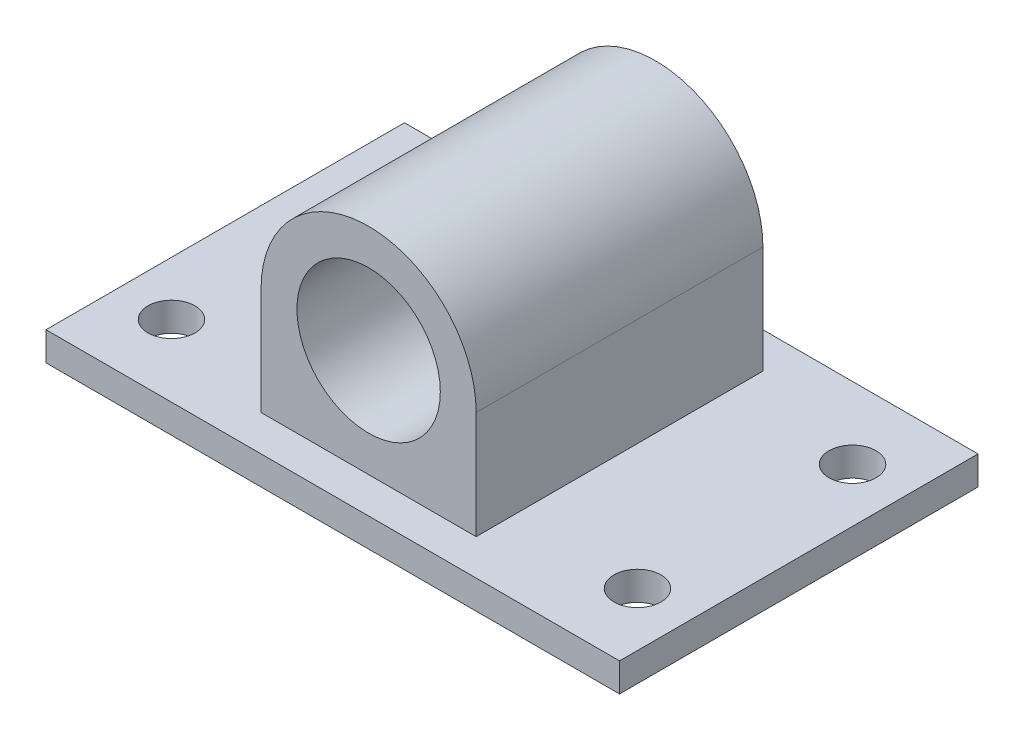
ISO-10303-21;
HEADER;
FILE_DESCRIPTION(('STEP AP214'),'2;1');
FILE_NAME('part.step','',(''),(''),'','','');
FILE_SCHEMA(('AUTOMOTIVE_DESIGN { 1 0 10303 214 1 1 1 1 }'));
ENDSEC;
DATA;
#1=APPLICATION_CONTEXT('core data for automotive mechanical design processes');
#2=APPLICATION_PROTOCOL_DEFINITION('international standard','automotive_design',2000,#1);
#3=PRODUCT_CONTEXT('',#1,'mechanical');
#4=PRODUCT('Part','Part','',(#3));
#5=PRODUCT_RELATED_PRODUCT_CATEGORY('part','',(#4));
#6=PRODUCT_DEFINITION_FORMATION('','',#4);
#7=PRODUCT_DEFINITION_CONTEXT('part definition',#1,'design');
#8=PRODUCT_DEFINITION('design','',#6,#7);
#9=PRODUCT_DEFINITION_SHAPE('','',#8);
#10=(LENGTH_UNIT() NAMED_UNIT(*) SI_UNIT(.MILLI.,.METRE.));
#11=(NAMED_UNIT(*) PLANE_ANGLE_UNIT() SI_UNIT($,.RADIAN.));
#12=(NAMED_UNIT(*) SI_UNIT($,.STERADIAN.) SOLID_ANGLE_UNIT());
#13=UNCERTAINTY_MEASURE_WITH_UNIT(LENGTH_MEASURE(1.E-05),#10,'distance_accuracy_value','');
#14=(GEOMETRIC_REPRESENTATION_CONTEXT(3) GLOBAL_UNCERTAINTY_ASSIGNED_CONTEXT((#13)) GLOBAL_UNIT_ASSIGNED_CONTEXT((#10,
#11,#12)) REPRESENTATION_CONTEXT('',''));
#15=CARTESIAN_POINT('',(0.,0.,0.));
#16=DIRECTION('',(0.,0.,1.));
#17=DIRECTION('',(1.,0.,0.));
#18=AXIS2_PLACEMENT_3D('',#15,#16,#17);
#19=CARTESIAN_POINT('',(0.,5.08,0.));
#20=DIRECTION('',(0.,-1.,0.));
#21=DIRECTION('',(0.,0.,-1.));
#22=AXIS2_PLACEMENT_3D('',#19,#20,#21);
#23=PLANE('',#22);
#24=DIRECTION('',(0.,0.,-1.));
#25=VECTOR('',#24,1.);
#26=CARTESIAN_POINT('',(50.8,5.08,31.75));
#27=LINE('',#26,#25);
#28=CARTESIAN_POINT('',(50.8,5.08,31.75));
#29=VERTEX_POINT('',#28);
#30=CARTESIAN_POINT('',(50.8,5.08,-31.75));
#31=VERTEX_POINT('',#30);
#32=EDGE_CURVE('E167',#29,#31,#27,.T.);
#33=ORIENTED_EDGE('',*,*,#32,.T.);
#34=DIRECTION('',(-1.,0.,0.));
#35=VECTOR('',#34,1.);
#36=CARTESIAN_POINT('',(-50.8,5.08,-31.75));
#37=LINE('',#36,#35);
#38=CARTESIAN_POINT('',(-50.8,5.08,-31.75));
#39=VERTEX_POINT('',#38);
#40=EDGE_CURVE('E171',#31,#39,#37,.T.);
#41=ORIENTED_EDGE('',*,*,#40,.T.);
#42=DIRECTION('',(0.,0.,1.));
#43=VECTOR('',#42,1.);
#44=CARTESIAN_POINT('',(-50.8,5.08,31.75));
#45=LINE('',#44,#43);
#46=CARTESIAN_POINT('',(-50.8,5.08,31.75));
#47=VERTEX_POINT('',#46);
#48=EDGE_CURVE('E175',#39,#47,#45,.T.);
#49=ORIENTED_EDGE('',*,*,#48,.T.);
#50=DIRECTION('',(1.,0.,0.));
#51=VECTOR('',#50,1.);
#52=CARTESIAN_POINT('',(-50.8,5.08,31.75));
#53=LINE('',#52,#51);
#54=EDGE_CURVE('E178',#47,#29,#53,.T.);
#55=ORIENTED_EDGE('',*,*,#54,.T.);
#56=EDGE_LOOP('',(#33,#41,#49,#55));
#57=FACE_BOUND('',#56,.T.);
#58=CARTESIAN_POINT('',(-41.275,5.08,-19.05));
#59=DIRECTION('',(0.,1.,0.));
#60=DIRECTION('',(0.,0.,1.));
#61=AXIS2_PLACEMENT_3D('',#58,#59,#60);
#62=CIRCLE('',#61,4.1656);
#63=CARTESIAN_POINT('',(-41.275,5.08,-14.8844));
#64=VERTEX_POINT('',#63);
#65=EDGE_CURVE('E159',#64,#64,#62,.T.);
#66=ORIENTED_EDGE('',*,*,#65,.F.);
#67=EDGE_LOOP('',(#66));
#68=FACE_BOUND('',#67,.T.);
#69=CARTESIAN_POINT('',(41.275,5.08,-19.05));
#70=DIRECTION('',(0.,1.,0.));
#71=DIRECTION('',(0.,0.,1.));
#72=AXIS2_PLACEMENT_3D('',#69,#70,#71);
#73=CIRCLE('',#72,4.1656);
#74=CARTESIAN_POINT('',(41.275,5.08,-14.8844));
#75=VERTEX_POINT('',#74);
#76=EDGE_CURVE('E139',#75,#75,#73,.T.);
#77=ORIENTED_EDGE('',*,*,#76,.F.);
#78=EDGE_LOOP('',(#77));
#79=FACE_BOUND('',#78,.T.);
#80=CARTESIAN_POINT('',(41.275,5.08,19.05));
#81=DIRECTION('',(0.,1.,0.));
#82=DIRECTION('',(0.,0.,1.));
#83=AXIS2_PLACEMENT_3D('',#80,#81,#82);
#84=CIRCLE('',#83,4.1656);
#85=CARTESIAN_POINT('',(41.275,5.08,23.2156));
#86=VERTEX_POINT('',#85);
#87=EDGE_CURVE('E148',#86,#86,#84,.T.);
#88=ORIENTED_EDGE('',*,*,#87,.F.);
#89=EDGE_LOOP('',(#88));
#90=FACE_BOUND('',#89,.T.);
#91=CARTESIAN_POINT('',(-41.275,5.08,19.05));
#92=DIRECTION('',(0.,1.,0.));
#93=DIRECTION('',(0.,0.,1.));
#94=AXIS2_PLACEMENT_3D('',#91,#92,#93);
#95=CIRCLE('',#94,4.1656);
#96=CARTESIAN_POINT('',(-41.275,5.08,23.2156));
#97=VERTEX_POINT('',#96);
#98=EDGE_CURVE('E133',#97,#97,#95,.T.);
#99=ORIENTED_EDGE('',*,*,#98,.F.);
#100=EDGE_LOOP('',(#99));
#101=FACE_BOUND('',#100,.T.);
#102=DIRECTION('',(0.,0.,-1.));
#103=VECTOR('',#102,1.);
#104=CARTESIAN_POINT('',(-19.05,5.08,25.4));
#105=LINE('',#104,#103);
#106=CARTESIAN_POINT('',(-19.05,5.08,25.4));
#107=VERTEX_POINT('',#106);
#108=CARTESIAN_POINT('',(-19.05,5.08,-25.4));
#109=VERTEX_POINT('',#108);
#110=EDGE_CURVE('E60',#107,#109,#105,.T.);
#111=ORIENTED_EDGE('',*,*,#110,.T.);
#112=DIRECTION('',(1.,0.,0.));
#113=VECTOR('',#112,1.);
#114=CARTESIAN_POINT('',(-19.05,5.08,-25.4));
#115=LINE('',#114,#113);
#116=CARTESIAN_POINT('',(19.05,5.08,-25.4));
#117=VERTEX_POINT('',#116);
#118=EDGE_CURVE('E386',#109,#117,#115,.T.);
#119=ORIENTED_EDGE('',*,*,#118,.T.);
#120=DIRECTION('',(0.,0.,-1.));
#121=VECTOR('',#120,1.);
#122=CARTESIAN_POINT('',(19.05,5.08,25.4));
#123=LINE('',#122,#121);
#124=CARTESIAN_POINT('',(19.05,5.08,25.4));
#125=VERTEX_POINT('',#124);
#126=EDGE_CURVE('E135',#125,#117,#123,.T.);
#127=ORIENTED_EDGE('',*,*,#126,.F.);
#128=DIRECTION('',(1.,0.,0.));
#129=VECTOR('',#128,1.);
#130=CARTESIAN_POINT('',(-19.05,5.08,25.4));
#131=LINE('',#130,#129);
#132=EDGE_CURVE('E55',#107,#125,#131,.T.);
#133=ORIENTED_EDGE('',*,*,#132,.F.);
#134=EDGE_LOOP('',(#111,#119,#127,#133));
#135=FACE_BOUND('',#134,.T.);
#136=ADVANCED_FACE('F39',(#57,#68,#79,#90,#101,#135),#23,.F.);
#137=CARTESIAN_POINT('',(50.8,5.08,31.75));
#138=DIRECTION('',(-1.,0.,0.));
#139=DIRECTION('',(0.,0.,1.));
#140=AXIS2_PLACEMENT_3D('',#137,#138,#139);
#141=PLANE('',#140);
#142=DIRECTION('',(0.,0.,-1.));
#143=VECTOR('',#142,1.);
#144=CARTESIAN_POINT('',(50.8,0.,31.75));
#145=LINE('',#144,#143);
#146=CARTESIAN_POINT('',(50.8,0.,31.75));
#147=VERTEX_POINT('',#146);
#148=CARTESIAN_POINT('',(50.8,0.,-31.75));
#149=VERTEX_POINT('',#148);
#150=EDGE_CURVE('E163',#147,#149,#145,.T.);
#151=ORIENTED_EDGE('',*,*,#150,.T.);
#152=DIRECTION('',(0.,-1.,0.));
#153=VECTOR('',#152,1.);
#154=CARTESIAN_POINT('',(50.8,5.08,-31.75));
#155=LINE('',#154,#153);
#156=EDGE_CURVE('E11',#31,#149,#155,.T.);
#157=ORIENTED_EDGE('',*,*,#156,.F.);
#158=ORIENTED_EDGE('',*,*,#32,.F.);
#159=DIRECTION('',(0.,-1.,0.));
#160=VECTOR('',#159,1.);
#161=CARTESIAN_POINT('',(50.8,5.08,31.75));
#162=LINE('',#161,#160);
#163=EDGE_CURVE('E181',#29,#147,#162,.T.);
#164=ORIENTED_EDGE('',*,*,#163,.T.);
#165=EDGE_LOOP('',(#151,#157,#158,#164));
#166=FACE_BOUND('',#165,.T.);
#167=ADVANCED_FACE('F41',(#166),#141,.F.);
#168=CARTESIAN_POINT('',(-50.8,5.08,-31.75));
#169=DIRECTION('',(0.,0.,1.));
#170=DIRECTION('',(1.,0.,0.));
#171=AXIS2_PLACEMENT_3D('',#168,#169,#170);
#172=PLANE('',#171);
#173=DIRECTION('',(-1.,0.,0.));
#174=VECTOR('',#173,1.);
#175=CARTESIAN_POINT('',(-50.8,0.,-31.75));
#176=LINE('',#175,#174);
#177=CARTESIAN_POINT('',(-50.8,0.,-31.75));
#178=VERTEX_POINT('',#177);
#179=EDGE_CURVE('E185',#149,#178,#176,.T.);
#180=ORIENTED_EDGE('',*,*,#179,.T.);
#181=DIRECTION('',(0.,-1.,0.));
#182=VECTOR('',#181,1.);
#183=CARTESIAN_POINT('',(-50.8,5.08,-31.75));
#184=LINE('',#183,#182);
#185=EDGE_CURVE('E48',#39,#178,#184,.T.);
#186=ORIENTED_EDGE('',*,*,#185,.F.);
#187=ORIENTED_EDGE('',*,*,#40,.F.);
#188=ORIENTED_EDGE('',*,*,#156,.T.);
#189=EDGE_LOOP('',(#180,#186,#187,#188));
#190=FACE_BOUND('',#189,.T.);
#191=ADVANCED_FACE('F221',(#190),#172,.F.);
#192=CARTESIAN_POINT('',(-50.8,5.08,31.75));
#193=DIRECTION('',(1.,0.,0.));
#194=DIRECTION('',(0.,0.,-1.));
#195=AXIS2_PLACEMENT_3D('',#192,#193,#194);
#196=PLANE('',#195);
#197=DIRECTION('',(0.,0.,1.));
#198=VECTOR('',#197,1.);
#199=CARTESIAN_POINT('',(-50.8,0.,31.75));
#200=LINE('',#199,#198);
#201=CARTESIAN_POINT('',(-50.8,0.,31.75));
#202=VERTEX_POINT('',#201);
#203=EDGE_CURVE('E188',#178,#202,#200,.T.);
#204=ORIENTED_EDGE('',*,*,#203,.T.);
#205=DIRECTION('',(0.,-1.,0.));
#206=VECTOR('',#205,1.);
#207=CARTESIAN_POINT('',(-50.8,5.08,31.75));
#208=LINE('',#207,#206);
#209=EDGE_CURVE('E196',#47,#202,#208,.T.);
#210=ORIENTED_EDGE('',*,*,#209,.F.);
#211=ORIENTED_EDGE('',*,*,#48,.F.);
#212=ORIENTED_EDGE('',*,*,#185,.T.);
#213=EDGE_LOOP('',(#204,#210,#211,#212));
#214=FACE_BOUND('',#213,.T.);
#215=ADVANCED_FACE('F205',(#214),#196,.F.);
#216=CARTESIAN_POINT('',(-50.8,5.08,31.75));
#217=DIRECTION('',(0.,0.,-1.));
#218=DIRECTION('',(-1.,0.,0.));
#219=AXIS2_PLACEMENT_3D('',#216,#217,#218);
#220=PLANE('',#219);
#221=DIRECTION('',(1.,0.,0.));
#222=VECTOR('',#221,1.);
#223=CARTESIAN_POINT('',(-50.8,0.,31.75));
#224=LINE('',#223,#222);
#225=EDGE_CURVE('E172',#202,#147,#224,.T.);
#226=ORIENTED_EDGE('',*,*,#225,.T.);
#227=ORIENTED_EDGE('',*,*,#163,.F.);
#228=ORIENTED_EDGE('',*,*,#54,.F.);
#229=ORIENTED_EDGE('',*,*,#209,.T.);
#230=EDGE_LOOP('',(#226,#227,#228,#229));
#231=FACE_BOUND('',#230,.T.);
#232=ADVANCED_FACE('F214',(#231),#220,.F.);
#233=CARTESIAN_POINT('',(0.,0.,0.));
#234=DIRECTION('',(0.,-1.,0.));
#235=DIRECTION('',(0.,0.,-1.));
#236=AXIS2_PLACEMENT_3D('',#233,#234,#235);
#237=PLANE('',#236);
#238=CARTESIAN_POINT('',(-41.275,0.,19.05));
#239=DIRECTION('',(0.,1.,0.));
#240=DIRECTION('',(0.,0.,1.));
#241=AXIS2_PLACEMENT_3D('',#238,#239,#240);
#242=CIRCLE('',#241,4.1656);
#243=CARTESIAN_POINT('',(-41.275,0.,23.2156));
#244=VERTEX_POINT('',#243);
#245=EDGE_CURVE('E128',#244,#244,#242,.T.);
#246=ORIENTED_EDGE('',*,*,#245,.T.);
#247=EDGE_LOOP('',(#246));
#248=FACE_BOUND('',#247,.T.);
#249=CARTESIAN_POINT('',(41.275,0.,19.05));
#250=DIRECTION('',(0.,1.,0.));
#251=DIRECTION('',(0.,0.,1.));
#252=AXIS2_PLACEMENT_3D('',#249,#250,#251);
#253=CIRCLE('',#252,4.1656);
#254=CARTESIAN_POINT('',(41.275,0.,23.2156));
#255=VERTEX_POINT('',#254);
#256=EDGE_CURVE('E152',#255,#255,#253,.T.);
#257=ORIENTED_EDGE('',*,*,#256,.T.);
#258=EDGE_LOOP('',(#257));
#259=FACE_BOUND('',#258,.T.);
#260=CARTESIAN_POINT('',(41.275,0.,-19.05));
#261=DIRECTION('',(0.,1.,0.));
#262=DIRECTION('',(0.,0.,1.));
#263=AXIS2_PLACEMENT_3D('',#260,#261,#262);
#264=CIRCLE('',#263,4.1656);
#265=CARTESIAN_POINT('',(41.275,0.,-14.8844));
#266=VERTEX_POINT('',#265);
#267=EDGE_CURVE('E144',#266,#266,#264,.T.);
#268=ORIENTED_EDGE('',*,*,#267,.T.);
#269=EDGE_LOOP('',(#268));
#270=FACE_BOUND('',#269,.T.);
#271=CARTESIAN_POINT('',(-41.275,0.,-19.05));
#272=DIRECTION('',(0.,1.,0.));
#273=DIRECTION('',(0.,0.,1.));
#274=AXIS2_PLACEMENT_3D('',#271,#272,#273);
#275=CIRCLE('',#274,4.1656);
#276=CARTESIAN_POINT('',(-41.275,0.,-14.8844));
#277=VERTEX_POINT('',#276);
#278=EDGE_CURVE('E143',#277,#277,#275,.T.);
#279=ORIENTED_EDGE('',*,*,#278,.T.);
#280=EDGE_LOOP('',(#279));
#281=FACE_BOUND('',#280,.T.);
#282=ORIENTED_EDGE('',*,*,#150,.F.);
#283=ORIENTED_EDGE('',*,*,#225,.F.);
#284=ORIENTED_EDGE('',*,*,#203,.F.);
#285=ORIENTED_EDGE('',*,*,#179,.F.);
#286=EDGE_LOOP('',(#282,#283,#284,#285));
#287=FACE_BOUND('',#286,.T.);
#288=ADVANCED_FACE('F211',(#248,#259,#270,#281,#287),#237,.T.);
#289=CARTESIAN_POINT('',(-41.275,5.08,-19.05));
#290=DIRECTION('',(0.,-1.,0.));
#291=DIRECTION('',(0.,0.,-1.));
#292=AXIS2_PLACEMENT_3D('',#289,#290,#291);
#293=CYLINDRICAL_SURFACE('',#292,4.1656);
#294=ORIENTED_EDGE('',*,*,#65,.T.);
#295=EDGE_LOOP('',(#294));
#296=FACE_BOUND('',#295,.T.);
#297=ORIENTED_EDGE('',*,*,#278,.F.);
#298=EDGE_LOOP('',(#297));
#299=FACE_BOUND('',#298,.T.);
#300=ADVANCED_FACE('F234',(#296,#299),#293,.F.);
#301=CARTESIAN_POINT('',(41.275,5.08,-19.05));
#302=DIRECTION('',(0.,-1.,0.));
#303=DIRECTION('',(0.,0.,-1.));
#304=AXIS2_PLACEMENT_3D('',#301,#302,#303);
#305=CYLINDRICAL_SURFACE('',#304,4.1656);
#306=ORIENTED_EDGE('',*,*,#76,.T.);
#307=EDGE_LOOP('',(#306));
#308=FACE_BOUND('',#307,.T.);
#309=ORIENTED_EDGE('',*,*,#267,.F.);
#310=EDGE_LOOP('',(#309));
#311=FACE_BOUND('',#310,.T.);
#312=ADVANCED_FACE('F254',(#308,#311),#305,.F.);
#313=CARTESIAN_POINT('',(41.275,5.08,19.05));
#314=DIRECTION('',(0.,-1.,0.));
#315=DIRECTION('',(0.,0.,-1.));
#316=AXIS2_PLACEMENT_3D('',#313,#314,#315);
#317=CYLINDRICAL_SURFACE('',#316,4.1656);
#318=ORIENTED_EDGE('',*,*,#87,.T.);
#319=EDGE_LOOP('',(#318));
#320=FACE_BOUND('',#319,.T.);
#321=ORIENTED_EDGE('',*,*,#256,.F.);
#322=EDGE_LOOP('',(#321));
#323=FACE_BOUND('',#322,.T.);
#324=ADVANCED_FACE('F261',(#320,#323),#317,.F.);
#325=CARTESIAN_POINT('',(-41.275,5.08,19.05));
#326=DIRECTION('',(0.,-1.,0.));
#327=DIRECTION('',(0.,0.,-1.));
#328=AXIS2_PLACEMENT_3D('',#325,#326,#327);
#329=CYLINDRICAL_SURFACE('',#328,4.1656);
#330=ORIENTED_EDGE('',*,*,#98,.T.);
#331=EDGE_LOOP('',(#330));
#332=FACE_BOUND('',#331,.T.);
#333=ORIENTED_EDGE('',*,*,#245,.F.);
#334=EDGE_LOOP('',(#333));
#335=FACE_BOUND('',#334,.T.);
#336=ADVANCED_FACE('F269',(#332,#335),#329,.F.);
#337=CARTESIAN_POINT('',(0.,24.13,25.4));
#338=DIRECTION('',(0.,0.,1.));
#339=DIRECTION('',(1.,0.,0.));
#340=AXIS2_PLACEMENT_3D('',#337,#338,#339);
#341=PLANE('',#340);
#342=CARTESIAN_POINT('',(0.,24.13,25.4));
#343=DIRECTION('',(0.,0.,1.));
#344=DIRECTION('',(1.,0.,0.));
#345=AXIS2_PLACEMENT_3D('',#342,#343,#344);
#346=CIRCLE('',#345,19.05);
#347=CARTESIAN_POINT('',(19.05,24.13,25.4));
#348=VERTEX_POINT('',#347);
#349=CARTESIAN_POINT('',(-19.05,24.13,25.4));
#350=VERTEX_POINT('',#349);
#351=EDGE_CURVE('E111',#348,#350,#346,.T.);
#352=ORIENTED_EDGE('',*,*,#351,.T.);
#353=DIRECTION('',(0.,-1.,0.));
#354=VECTOR('',#353,1.);
#355=CARTESIAN_POINT('',(-19.05,24.13,25.4));
#356=LINE('',#355,#354);
#357=EDGE_CURVE('E103',#350,#107,#356,.T.);
#358=ORIENTED_EDGE('',*,*,#357,.T.);
#359=ORIENTED_EDGE('',*,*,#132,.T.);
#360=DIRECTION('',(0.,1.,0.));
#361=VECTOR('',#360,1.);
#362=CARTESIAN_POINT('',(19.05,5.08,25.4));
#363=LINE('',#362,#361);
#364=EDGE_CURVE('E117',#125,#348,#363,.T.);
#365=ORIENTED_EDGE('',*,*,#364,.T.);
#366=EDGE_LOOP('',(#352,#358,#359,#365));
#367=FACE_BOUND('',#366,.T.);
#368=CARTESIAN_POINT('',(0.,24.13,25.4));
#369=DIRECTION('',(0.,0.,1.));
#370=DIRECTION('',(1.,0.,0.));
#371=AXIS2_PLACEMENT_3D('',#368,#369,#370);
#372=CIRCLE('',#371,12.7);
#373=CARTESIAN_POINT('',(12.7,24.13,25.4));
#374=VERTEX_POINT('',#373);
#375=EDGE_CURVE('E366',#374,#374,#372,.T.);
#376=ORIENTED_EDGE('',*,*,#375,.F.);
#377=EDGE_LOOP('',(#376));
#378=FACE_BOUND('',#377,.T.);
#379=ADVANCED_FACE('F114',(#367,#378),#341,.T.);
#380=CARTESIAN_POINT('',(0.,24.13,-25.4));
#381=DIRECTION('',(0.,0.,1.));
#382=DIRECTION('',(1.,0.,0.));
#383=AXIS2_PLACEMENT_3D('',#380,#381,#382);
#384=PLANE('',#383);
#385=CARTESIAN_POINT('',(0.,24.13,-25.4));
#386=DIRECTION('',(0.,0.,1.));
#387=DIRECTION('',(1.,0.,0.));
#388=AXIS2_PLACEMENT_3D('',#385,#386,#387);
#389=CIRCLE('',#388,19.05);
#390=CARTESIAN_POINT('',(19.05,24.13,-25.4));
#391=VERTEX_POINT('',#390);
#392=CARTESIAN_POINT('',(-19.05,24.13,-25.4));
#393=VERTEX_POINT('',#392);
#394=EDGE_CURVE('E126',#391,#393,#389,.T.);
#395=ORIENTED_EDGE('',*,*,#394,.F.);
#396=DIRECTION('',(0.,1.,0.));
#397=VECTOR('',#396,1.);
#398=CARTESIAN_POINT('',(19.05,5.08,-25.4));
#399=LINE('',#398,#397);
#400=EDGE_CURVE('E122',#117,#391,#399,.T.);
#401=ORIENTED_EDGE('',*,*,#400,.F.);
#402=ORIENTED_EDGE('',*,*,#118,.F.);
#403=DIRECTION('',(0.,-1.,0.));
#404=VECTOR('',#403,1.);
#405=CARTESIAN_POINT('',(-19.05,24.13,-25.4));
#406=LINE('',#405,#404);
#407=EDGE_CURVE('E383',#393,#109,#406,.T.);
#408=ORIENTED_EDGE('',*,*,#407,.F.);
#409=EDGE_LOOP('',(#395,#401,#402,#408));
#410=FACE_BOUND('',#409,.T.);
#411=CARTESIAN_POINT('',(0.,24.13,-25.4));
#412=DIRECTION('',(0.,0.,1.));
#413=DIRECTION('',(1.,0.,0.));
#414=AXIS2_PLACEMENT_3D('',#411,#412,#413);
#415=CIRCLE('',#414,12.7);
#416=CARTESIAN_POINT('',(12.7,24.13,-25.4));
#417=VERTEX_POINT('',#416);
#418=EDGE_CURVE('E369',#417,#417,#415,.T.);
#419=ORIENTED_EDGE('',*,*,#418,.T.);
#420=EDGE_LOOP('',(#419));
#421=FACE_BOUND('',#420,.T.);
#422=ADVANCED_FACE('F283',(#410,#421),#384,.F.);
#423=CARTESIAN_POINT('',(0.,24.13,25.4));
#424=DIRECTION('',(0.,0.,-1.));
#425=DIRECTION('',(-1.,0.,0.));
#426=AXIS2_PLACEMENT_3D('',#423,#424,#425);
#427=CYLINDRICAL_SURFACE('',#426,19.05);
#428=ORIENTED_EDGE('',*,*,#394,.T.);
#429=DIRECTION('',(0.,0.,-1.));
#430=VECTOR('',#429,1.);
#431=CARTESIAN_POINT('',(-19.05,24.13,25.4));
#432=LINE('',#431,#430);
#433=EDGE_CURVE('E107',#350,#393,#432,.T.);
#434=ORIENTED_EDGE('',*,*,#433,.F.);
#435=ORIENTED_EDGE('',*,*,#351,.F.);
#436=DIRECTION('',(0.,0.,-1.));
#437=VECTOR('',#436,1.);
#438=CARTESIAN_POINT('',(19.05,24.13,25.4));
#439=LINE('',#438,#437);
#440=EDGE_CURVE('E380',#348,#391,#439,.T.);
#441=ORIENTED_EDGE('',*,*,#440,.T.);
#442=EDGE_LOOP('',(#428,#434,#435,#441));
#443=FACE_BOUND('',#442,.T.);
#444=ADVANCED_FACE('F124',(#443),#427,.T.);
#445=CARTESIAN_POINT('',(-19.05,24.13,25.4));
#446=DIRECTION('',(1.,0.,0.));
#447=DIRECTION('',(0.,1.,0.));
#448=AXIS2_PLACEMENT_3D('',#445,#446,#447);
#449=PLANE('',#448);
#450=ORIENTED_EDGE('',*,*,#407,.T.);
#451=ORIENTED_EDGE('',*,*,#110,.F.);
#452=ORIENTED_EDGE('',*,*,#357,.F.);
#453=ORIENTED_EDGE('',*,*,#433,.T.);
#454=EDGE_LOOP('',(#450,#451,#452,#453));
#455=FACE_BOUND('',#454,.T.);
#456=ADVANCED_FACE('F105',(#455),#449,.F.);
#457=CARTESIAN_POINT('',(19.05,5.08,25.4));
#458=DIRECTION('',(-1.,0.,0.));
#459=DIRECTION('',(0.,-1.,0.));
#460=AXIS2_PLACEMENT_3D('',#457,#458,#459);
#461=PLANE('',#460);
#462=ORIENTED_EDGE('',*,*,#400,.T.);
#463=ORIENTED_EDGE('',*,*,#440,.F.);
#464=ORIENTED_EDGE('',*,*,#364,.F.);
#465=ORIENTED_EDGE('',*,*,#126,.T.);
#466=EDGE_LOOP('',(#462,#463,#464,#465));
#467=FACE_BOUND('',#466,.T.);
#468=ADVANCED_FACE('F303',(#467),#461,.F.);
#469=CARTESIAN_POINT('',(0.,24.13,25.4));
#470=DIRECTION('',(0.,0.,-1.));
#471=DIRECTION('',(-1.,0.,0.));
#472=AXIS2_PLACEMENT_3D('',#469,#470,#471);
#473=CYLINDRICAL_SURFACE('',#472,12.7);
#474=ORIENTED_EDGE('',*,*,#375,.T.);
#475=EDGE_LOOP('',(#474));
#476=FACE_BOUND('',#475,.T.);
#477=ORIENTED_EDGE('',*,*,#418,.F.);
#478=EDGE_LOOP('',(#477));
#479=FACE_BOUND('',#478,.T.);
#480=ADVANCED_FACE('F310',(#476,#479),#473,.F.);
#481=CLOSED_SHELL('',(#136,#167,#191,#215,#232,#288,#300,#312,#324,#336,#379,#422,#444,#456,
#468,#480));
#482=MANIFOLD_SOLID_BREP('B2',#481);
#483=ADVANCED_BREP_SHAPE_REPRESENTATION('',(#18,#482),#14);
#484=SHAPE_DEFINITION_REPRESENTATION(#9,#483);
ENDSEC;
END-ISO-10303-21;
